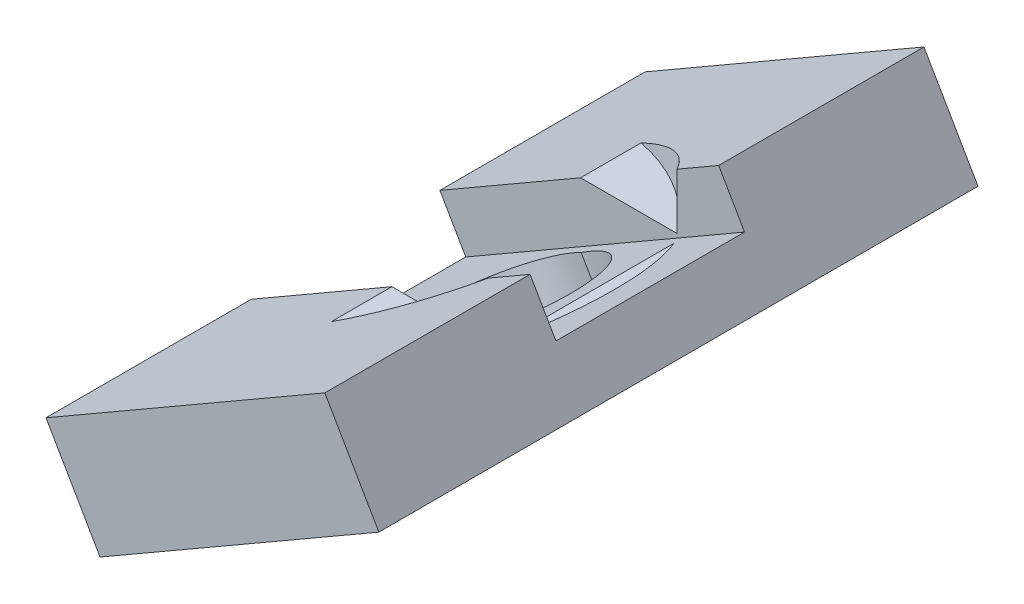
ISO-10303-21;
HEADER;
FILE_DESCRIPTION(('STEP AP214'),'2;1');
FILE_NAME('part.step','',(''),(''),'','','');
FILE_SCHEMA(('AUTOMOTIVE_DESIGN { 1 0 10303 214 1 1 1 1 }'));
ENDSEC;
DATA;
#1=APPLICATION_CONTEXT('core data for automotive mechanical design processes');
#2=APPLICATION_PROTOCOL_DEFINITION('international standard','automotive_design',2000,#1);
#3=PRODUCT_CONTEXT('',#1,'mechanical');
#4=PRODUCT('Part','Part','',(#3));
#5=PRODUCT_RELATED_PRODUCT_CATEGORY('part','',(#4));
#6=PRODUCT_DEFINITION_FORMATION('','',#4);
#7=PRODUCT_DEFINITION_CONTEXT('part definition',#1,'design');
#8=PRODUCT_DEFINITION('design','',#6,#7);
#9=PRODUCT_DEFINITION_SHAPE('','',#8);
#10=(LENGTH_UNIT() NAMED_UNIT(*) SI_UNIT(.MILLI.,.METRE.));
#11=(NAMED_UNIT(*) PLANE_ANGLE_UNIT() SI_UNIT($,.RADIAN.));
#12=(NAMED_UNIT(*) SI_UNIT($,.STERADIAN.) SOLID_ANGLE_UNIT());
#13=UNCERTAINTY_MEASURE_WITH_UNIT(LENGTH_MEASURE(1.E-05),#10,'distance_accuracy_value','');
#14=(GEOMETRIC_REPRESENTATION_CONTEXT(3) GLOBAL_UNCERTAINTY_ASSIGNED_CONTEXT((#13)) GLOBAL_UNIT_ASSIGNED_CONTEXT((#10,
#11,#12)) REPRESENTATION_CONTEXT('',''));
#15=CARTESIAN_POINT('',(0.,0.,0.));
#16=DIRECTION('',(0.,0.,1.));
#17=DIRECTION('',(1.,0.,0.));
#18=AXIS2_PLACEMENT_3D('',#15,#16,#17);
#19=CARTESIAN_POINT('',(0.,12.7,0.));
#20=DIRECTION('',(0.,-1.,0.));
#21=DIRECTION('',(0.,0.,-1.));
#22=AXIS2_PLACEMENT_3D('',#19,#20,#21);
#23=CYLINDRICAL_SURFACE('',#22,18.034);
#24=CARTESIAN_POINT('',(0.,-1.9646968374165,0.));
#25=DIRECTION('',(0.5,-0.866025403784439,0.));
#26=DIRECTION('',(-0.866025403784439,-0.5,0.));
#27=AXIS2_PLACEMENT_3D('',#24,#25,#26);
#28=ELLIPSE('',#27,20.8238695091314,18.034);
#29=CARTESIAN_POINT('',(3.40295474387526,0.,-17.7100269624622));
#30=VERTEX_POINT('',#29);
#31=CARTESIAN_POINT('',(14.446215109848,6.37582934502547,-10.795));
#32=VERTEX_POINT('',#31);
#33=EDGE_CURVE('E172',#30,#32,#28,.T.);
#34=ORIENTED_EDGE('',*,*,#33,.F.);
#35=CARTESIAN_POINT('',(0.,0.,0.));
#36=DIRECTION('',(0.,1.,0.));
#37=DIRECTION('',(0.,0.,1.));
#38=AXIS2_PLACEMENT_3D('',#35,#36,#37);
#39=CIRCLE('',#38,18.034);
#40=CARTESIAN_POINT('',(14.446215109848,0.,-10.795));
#41=VERTEX_POINT('',#40);
#42=EDGE_CURVE('E273',#41,#30,#39,.T.);
#43=ORIENTED_EDGE('',*,*,#42,.F.);
#44=DIRECTION('',(0.,-1.,0.));
#45=VECTOR('',#44,1.);
#46=CARTESIAN_POINT('',(14.446215109848,12.7,-10.795));
#47=LINE('',#46,#45);
#48=EDGE_CURVE('E221',#32,#41,#47,.T.);
#49=ORIENTED_EDGE('',*,*,#48,.F.);
#50=EDGE_LOOP('',(#34,#43,#49));
#51=FACE_BOUND('',#50,.T.);
#52=ADVANCED_FACE('F33',(#51),#23,.F.);
#53=CARTESIAN_POINT('',(-25.4,12.7,34.29));
#54=DIRECTION('',(0.,0.,-1.));
#55=DIRECTION('',(-1.,0.,0.));
#56=AXIS2_PLACEMENT_3D('',#53,#54,#55);
#57=PLANE('',#56);
#58=DIRECTION('',(0.866025403784439,0.5,0.));
#59=VECTOR('',#58,1.);
#60=CARTESIAN_POINT('',(-12.7,-23.5845452561248,34.29));
#61=LINE('',#60,#59);
#62=CARTESIAN_POINT('',(-6.51333102171488,-20.0126702561248,34.29));
#63=VERTEX_POINT('',#62);
#64=CARTESIAN_POINT('',(25.4,-1.58750000000005,34.29));
#65=VERTEX_POINT('',#64);
#66=EDGE_CURVE('E265',#63,#65,#61,.T.);
#67=ORIENTED_EDGE('',*,*,#66,.T.);
#68=DIRECTION('',(0.5,-0.866025403784439,0.));
#69=VECTOR('',#68,1.);
#70=CARTESIAN_POINT('',(25.4,-1.58750000000005,34.29));
#71=LINE('',#70,#69);
#72=CARTESIAN_POINT('',(19.2133310217149,9.12812499999998,34.29));
#73=VERTEX_POINT('',#72);
#74=EDGE_CURVE('E158',#73,#65,#71,.T.);
#75=ORIENTED_EDGE('',*,*,#74,.F.);
#76=DIRECTION('',(0.866025403784439,0.5,0.));
#77=VECTOR('',#76,1.);
#78=CARTESIAN_POINT('',(19.2133310217149,9.12812499999998,34.29));
#79=LINE('',#78,#77);
#80=CARTESIAN_POINT('',(-12.7,-9.29704525612474,34.29));
#81=VERTEX_POINT('',#80);
#82=EDGE_CURVE('E160',#81,#73,#79,.T.);
#83=ORIENTED_EDGE('',*,*,#82,.F.);
#84=DIRECTION('',(-0.5,0.866025403784438,0.));
#85=VECTOR('',#84,1.);
#86=CARTESIAN_POINT('',(-25.4,12.7,34.29));
#87=LINE('',#86,#85);
#88=EDGE_CURVE('E186',#63,#81,#87,.T.);
#89=ORIENTED_EDGE('',*,*,#88,.F.);
#90=EDGE_LOOP('',(#67,#75,#83,#89));
#91=FACE_BOUND('',#90,.T.);
#92=ADVANCED_FACE('F253',(#91),#57,.F.);
#93=CARTESIAN_POINT('',(-25.4,12.7,-34.29));
#94=DIRECTION('',(0.,0.,1.));
#95=DIRECTION('',(1.,0.,0.));
#96=AXIS2_PLACEMENT_3D('',#93,#94,#95);
#97=PLANE('',#96);
#98=DIRECTION('',(0.866025403784439,0.5,0.));
#99=VECTOR('',#98,1.);
#100=CARTESIAN_POINT('',(19.2133310217149,9.12812499999998,-34.29));
#101=LINE('',#100,#99);
#102=CARTESIAN_POINT('',(-12.7,-9.29704525612474,-34.29));
#103=VERTEX_POINT('',#102);
#104=CARTESIAN_POINT('',(19.2133310217149,9.12812499999998,-34.29));
#105=VERTEX_POINT('',#104);
#106=EDGE_CURVE('E48',#103,#105,#101,.T.);
#107=ORIENTED_EDGE('',*,*,#106,.T.);
#108=DIRECTION('',(0.5,-0.866025403784439,0.));
#109=VECTOR('',#108,1.);
#110=CARTESIAN_POINT('',(25.4,-1.58750000000005,-34.29));
#111=LINE('',#110,#109);
#112=CARTESIAN_POINT('',(25.4,-1.58750000000005,-34.29));
#113=VERTEX_POINT('',#112);
#114=EDGE_CURVE('E149',#105,#113,#111,.T.);
#115=ORIENTED_EDGE('',*,*,#114,.T.);
#116=DIRECTION('',(-0.866025403784439,-0.5,0.));
#117=VECTOR('',#116,1.);
#118=CARTESIAN_POINT('',(-12.7,-23.5845452561248,-34.29));
#119=LINE('',#118,#117);
#120=CARTESIAN_POINT('',(-6.51333102171488,-20.0126702561248,-34.29));
#121=VERTEX_POINT('',#120);
#122=EDGE_CURVE('E267',#113,#121,#119,.T.);
#123=ORIENTED_EDGE('',*,*,#122,.T.);
#124=DIRECTION('',(-0.5,0.866025403784438,0.));
#125=VECTOR('',#124,1.);
#126=CARTESIAN_POINT('',(-25.4,12.7,-34.29));
#127=LINE('',#126,#125);
#128=EDGE_CURVE('E55',#121,#103,#127,.T.);
#129=ORIENTED_EDGE('',*,*,#128,.T.);
#130=EDGE_LOOP('',(#107,#115,#123,#129));
#131=FACE_BOUND('',#130,.T.);
#132=ADVANCED_FACE('F35',(#131),#97,.F.);
#133=CARTESIAN_POINT('',(0.,0.,0.));
#134=DIRECTION('',(0.,-1.,0.));
#135=DIRECTION('',(0.,0.,-1.));
#136=AXIS2_PLACEMENT_3D('',#133,#134,#135);
#137=PLANE('',#136);
#138=ORIENTED_EDGE('',*,*,#42,.T.);
#139=DIRECTION('',(0.,0.,1.));
#140=VECTOR('',#139,1.);
#141=CARTESIAN_POINT('',(3.40295474387526,0.,0.));
#142=LINE('',#141,#140);
#143=CARTESIAN_POINT('',(3.40295474387523,0.,-10.795));
#144=VERTEX_POINT('',#143);
#145=EDGE_CURVE('E178',#30,#144,#142,.T.);
#146=ORIENTED_EDGE('',*,*,#145,.T.);
#147=DIRECTION('',(1.,0.,0.));
#148=VECTOR('',#147,1.);
#149=CARTESIAN_POINT('',(0.,0.,-10.795));
#150=LINE('',#149,#148);
#151=EDGE_CURVE('E219',#144,#41,#150,.T.);
#152=ORIENTED_EDGE('',*,*,#151,.T.);
#153=EDGE_LOOP('',(#138,#146,#152));
#154=FACE_BOUND('',#153,.T.);
#155=ADVANCED_FACE('F248',(#154),#137,.F.);
#156=DIRECTION('',(-1.,0.,0.));
#157=VECTOR('',#156,1.);
#158=CARTESIAN_POINT('',(0.,0.,10.795));
#159=LINE('',#158,#157);
#160=CARTESIAN_POINT('',(14.446215109848,0.,10.795));
#161=VERTEX_POINT('',#160);
#162=CARTESIAN_POINT('',(3.40295474387526,0.,10.795));
#163=VERTEX_POINT('',#162);
#164=EDGE_CURVE('E213',#161,#163,#159,.T.);
#165=ORIENTED_EDGE('',*,*,#164,.T.);
#166=DIRECTION('',(0.,0.,1.));
#167=VECTOR('',#166,1.);
#168=CARTESIAN_POINT('',(3.40295474387526,0.,0.));
#169=LINE('',#168,#167);
#170=CARTESIAN_POINT('',(3.40295474387526,0.,17.7100269624622));
#171=VERTEX_POINT('',#170);
#172=EDGE_CURVE('E171',#163,#171,#169,.T.);
#173=ORIENTED_EDGE('',*,*,#172,.T.);
#174=EDGE_CURVE('E271',#171,#161,#39,.T.);
#175=ORIENTED_EDGE('',*,*,#174,.T.);
#176=EDGE_LOOP('',(#165,#173,#175));
#177=FACE_BOUND('',#176,.T.);
#178=ADVANCED_FACE('F249',(#177),#137,.F.);
#179=CARTESIAN_POINT('',(14.446215109848,6.37582934502547,10.795));
#180=VERTEX_POINT('',#179);
#181=EDGE_CURVE('E168',#180,#171,#28,.T.);
#182=ORIENTED_EDGE('',*,*,#181,.F.);
#183=DIRECTION('',(0.,-1.,0.));
#184=VECTOR('',#183,1.);
#185=CARTESIAN_POINT('',(14.446215109848,12.7,10.795));
#186=LINE('',#185,#184);
#187=EDGE_CURVE('E216',#161,#180,#186,.F.);
#188=ORIENTED_EDGE('',*,*,#187,.F.);
#189=ORIENTED_EDGE('',*,*,#174,.F.);
#190=EDGE_LOOP('',(#182,#188,#189));
#191=FACE_BOUND('',#190,.T.);
#192=ADVANCED_FACE('F240',(#191),#23,.F.);
#193=CARTESIAN_POINT('',(-12.7,-23.5845452561248,-89.6480165829666));
#194=DIRECTION('',(0.5,-0.866025403784439,0.));
#195=DIRECTION('',(0.866025403784439,0.5,0.));
#196=AXIS2_PLACEMENT_3D('',#193,#194,#195);
#197=PLANE('',#196);
#198=DIRECTION('',(0.,0.,1.));
#199=VECTOR('',#198,1.);
#200=CARTESIAN_POINT('',(-6.51333102171488,-20.0126702561248,-34.29));
#201=LINE('',#200,#199);
#202=EDGE_CURVE('E188',#121,#63,#201,.T.);
#203=ORIENTED_EDGE('',*,*,#202,.F.);
#204=ORIENTED_EDGE('',*,*,#122,.F.);
#205=DIRECTION('',(0.,0.,-1.));
#206=VECTOR('',#205,1.);
#207=CARTESIAN_POINT('',(25.4,-1.5875,34.29));
#208=LINE('',#207,#206);
#209=EDGE_CURVE('E152',#65,#113,#208,.T.);
#210=ORIENTED_EDGE('',*,*,#209,.F.);
#211=ORIENTED_EDGE('',*,*,#66,.F.);
#212=EDGE_LOOP('',(#203,#204,#210,#211));
#213=FACE_BOUND('',#212,.T.);
#214=CARTESIAN_POINT('',(7.03740766425392,-12.1891476280624,0.));
#215=DIRECTION('',(0.5,-0.866025403784439,0.));
#216=DIRECTION('',(0.,0.,-1.));
#217=AXIS2_PLACEMENT_3D('',#214,#215,#216);
#218=ELLIPSE('',#217,9.525,8.24889197104678);
#219=CARTESIAN_POINT('',(8.06851916063477,-11.5938351280624,9.42525903158634));
#220=VERTEX_POINT('',#219);
#221=CARTESIAN_POINT('',(8.06851916063477,-11.5938351280624,-9.42525903158635));
#222=VERTEX_POINT('',#221);
#223=EDGE_CURVE('E224',#220,#222,#218,.T.);
#224=ORIENTED_EDGE('',*,*,#223,.F.);
#225=CARTESIAN_POINT('',(9.09963065701561,-10.9985226280624,0.));
#226=DIRECTION('',(0.5,-0.866025403784439,0.));
#227=DIRECTION('',(0.,0.,1.));
#228=AXIS2_PLACEMENT_3D('',#225,#226,#227);
#229=ELLIPSE('',#228,9.525,8.24889197104678);
#230=EDGE_CURVE('E315',#222,#220,#229,.T.);
#231=ORIENTED_EDGE('',*,*,#230,.F.);
#232=EDGE_LOOP('',(#224,#231));
#233=FACE_BOUND('',#232,.T.);
#234=ADVANCED_FACE('F235',(#213,#233),#197,.T.);
#235=CARTESIAN_POINT('',(-12.0219375431584,20.8226066301701,0.));
#236=DIRECTION('',(0.5,-0.866025403784439,0.));
#237=DIRECTION('',(0.,0.,-1.));
#238=AXIS2_PLACEMENT_3D('',#235,#236,#237);
#239=ELLIPSE('',#238,9.525,8.24889197104678);
#240=DIRECTION('',(0.5,-0.866025403784439,0.));
#241=VECTOR('',#240,1.);
#242=SURFACE_OF_LINEAR_EXTRUSION('',#239,#241);
#243=DIRECTION('',(0.5,-0.866025403784439,0.));
#244=VECTOR('',#243,1.);
#245=CARTESIAN_POINT('',(-10.9908260467775,21.4179191301701,-9.42525903158635));
#246=LINE('',#245,#244);
#247=CARTESIAN_POINT('',(4.84111149638086,-6.00380107683744,-9.42525903158635));
#248=VERTEX_POINT('',#247);
#249=EDGE_CURVE('E311',#248,#222,#246,.T.);
#250=ORIENTED_EDGE('',*,*,#249,.F.);
#251=CARTESIAN_POINT('',(3.81,-6.59911357683744,0.));
#252=DIRECTION('',(0.5,-0.866025403784439,0.));
#253=DIRECTION('',(0.,0.,-1.));
#254=AXIS2_PLACEMENT_3D('',#251,#252,#253);
#255=ELLIPSE('',#254,9.525,8.24889197104678);
#256=CARTESIAN_POINT('',(4.84111149638085,-6.00380107683744,9.42525903158634));
#257=VERTEX_POINT('',#256);
#258=EDGE_CURVE('E278',#248,#257,#255,.F.);
#259=ORIENTED_EDGE('',*,*,#258,.T.);
#260=DIRECTION('',(0.5,-0.866025403784439,0.));
#261=VECTOR('',#260,1.);
#262=CARTESIAN_POINT('',(-10.9908260467775,21.4179191301701,9.42525903158634));
#263=LINE('',#262,#261);
#264=EDGE_CURVE('E268',#257,#220,#263,.T.);
#265=ORIENTED_EDGE('',*,*,#264,.T.);
#266=ORIENTED_EDGE('',*,*,#223,.T.);
#267=EDGE_LOOP('',(#250,#259,#265,#266));
#268=FACE_BOUND('',#267,.T.);
#269=ADVANCED_FACE('F230',(#268),#242,.F.);
#270=CARTESIAN_POINT('',(-9.95971455039669,22.0132316301701,0.));
#271=DIRECTION('',(0.5,-0.866025403784439,0.));
#272=DIRECTION('',(0.,0.,1.));
#273=AXIS2_PLACEMENT_3D('',#270,#271,#272);
#274=ELLIPSE('',#273,9.525,8.24889197104678);
#275=DIRECTION('',(0.5,-0.866025403784439,0.));
#276=VECTOR('',#275,1.);
#277=SURFACE_OF_LINEAR_EXTRUSION('',#274,#276);
#278=ORIENTED_EDGE('',*,*,#264,.F.);
#279=CARTESIAN_POINT('',(5.8722229927617,-5.40848857683744,0.));
#280=DIRECTION('',(0.5,-0.866025403784439,0.));
#281=DIRECTION('',(0.,0.,1.));
#282=AXIS2_PLACEMENT_3D('',#279,#280,#281);
#283=ELLIPSE('',#282,9.525,8.24889197104678);
#284=EDGE_CURVE('E204',#257,#248,#283,.F.);
#285=ORIENTED_EDGE('',*,*,#284,.T.);
#286=ORIENTED_EDGE('',*,*,#249,.T.);
#287=ORIENTED_EDGE('',*,*,#230,.T.);
#288=EDGE_LOOP('',(#278,#285,#286,#287));
#289=FACE_BOUND('',#288,.T.);
#290=ADVANCED_FACE('F234',(#289),#277,.F.);
#291=CARTESIAN_POINT('',(20.9119375431585,20.8723308722691,-10.795));
#292=DIRECTION('',(0.,0.,-1.));
#293=DIRECTION('',(0.,1.,0.));
#294=AXIS2_PLACEMENT_3D('',#291,#292,#293);
#295=PLANE('',#294);
#296=DIRECTION('',(-0.866025403784439,-0.5,0.));
#297=VECTOR('',#296,1.);
#298=CARTESIAN_POINT('',(28.5319375431585,7.67410371859422,-10.795));
#299=LINE('',#298,#297);
#300=CARTESIAN_POINT('',(22.1725923357461,4.00253405122493,-10.795));
#301=VERTEX_POINT('',#300);
#302=CARTESIAN_POINT('',(-9.7407386859688,-14.4226362048998,-10.795));
#303=VERTEX_POINT('',#302);
#304=EDGE_CURVE('E201',#301,#303,#299,.T.);
#305=ORIENTED_EDGE('',*,*,#304,.F.);
#306=DIRECTION('',(-0.5,0.866025403784439,0.));
#307=VECTOR('',#306,1.);
#308=CARTESIAN_POINT('',(14.5525923357461,17.2007612048998,-10.795));
#309=LINE('',#308,#307);
#310=CARTESIAN_POINT('',(19.2133310217149,9.12812499999998,-10.795));
#311=VERTEX_POINT('',#310);
#312=EDGE_CURVE('E184',#301,#311,#309,.T.);
#313=ORIENTED_EDGE('',*,*,#312,.T.);
#314=DIRECTION('',(-0.866025403784439,-0.5,0.));
#315=VECTOR('',#314,1.);
#316=CARTESIAN_POINT('',(25.5726762291273,12.7996946673693,-10.795));
#317=LINE('',#316,#315);
#318=EDGE_CURVE('E142',#311,#32,#317,.T.);
#319=ORIENTED_EDGE('',*,*,#318,.T.);
#320=ORIENTED_EDGE('',*,*,#48,.T.);
#321=ORIENTED_EDGE('',*,*,#151,.F.);
#322=CARTESIAN_POINT('',(-12.7,-9.29704525612474,-10.795));
#323=VERTEX_POINT('',#322);
#324=EDGE_CURVE('E175',#144,#323,#317,.T.);
#325=ORIENTED_EDGE('',*,*,#324,.T.);
#326=DIRECTION('',(0.5,-0.866025403784438,0.));
#327=VECTOR('',#326,1.);
#328=CARTESIAN_POINT('',(-17.3607386859688,-1.22440905122497,-10.795));
#329=LINE('',#328,#327);
#330=EDGE_CURVE('E195',#323,#303,#329,.T.);
#331=ORIENTED_EDGE('',*,*,#330,.T.);
#332=EDGE_LOOP('',(#305,#313,#319,#320,#321,#325,#331));
#333=FACE_BOUND('',#332,.T.);
#334=ADVANCED_FACE('F293',(#333),#295,.F.);
#335=CARTESIAN_POINT('',(20.9119375431585,20.8723308722691,10.795));
#336=DIRECTION('',(0.,0.,1.));
#337=DIRECTION('',(0.,-1.,0.));
#338=AXIS2_PLACEMENT_3D('',#335,#336,#337);
#339=PLANE('',#338);
#340=DIRECTION('',(-0.5,0.866025403784438,0.));
#341=VECTOR('',#340,1.);
#342=CARTESIAN_POINT('',(-17.3607386859688,-1.22440905122497,10.795));
#343=LINE('',#342,#341);
#344=CARTESIAN_POINT('',(-9.7407386859688,-14.4226362048998,10.795));
#345=VERTEX_POINT('',#344);
#346=CARTESIAN_POINT('',(-12.7,-9.29704525612474,10.795));
#347=VERTEX_POINT('',#346);
#348=EDGE_CURVE('E192',#345,#347,#343,.T.);
#349=ORIENTED_EDGE('',*,*,#348,.T.);
#350=DIRECTION('',(0.866025403784439,0.5,0.));
#351=VECTOR('',#350,1.);
#352=CARTESIAN_POINT('',(25.5726762291273,12.7996946673693,10.795));
#353=LINE('',#352,#351);
#354=EDGE_CURVE('E169',#347,#163,#353,.T.);
#355=ORIENTED_EDGE('',*,*,#354,.T.);
#356=ORIENTED_EDGE('',*,*,#164,.F.);
#357=ORIENTED_EDGE('',*,*,#187,.T.);
#358=CARTESIAN_POINT('',(19.2133310217149,9.12812499999998,10.795));
#359=VERTEX_POINT('',#358);
#360=EDGE_CURVE('E145',#180,#359,#353,.T.);
#361=ORIENTED_EDGE('',*,*,#360,.T.);
#362=DIRECTION('',(0.5,-0.866025403784439,0.));
#363=VECTOR('',#362,1.);
#364=CARTESIAN_POINT('',(14.5525923357461,17.2007612048998,10.795));
#365=LINE('',#364,#363);
#366=CARTESIAN_POINT('',(22.1725923357461,4.00253405122493,10.795));
#367=VERTEX_POINT('',#366);
#368=EDGE_CURVE('E181',#359,#367,#365,.T.);
#369=ORIENTED_EDGE('',*,*,#368,.T.);
#370=DIRECTION('',(-0.866025403784439,-0.5,0.));
#371=VECTOR('',#370,1.);
#372=CARTESIAN_POINT('',(28.5319375431585,7.67410371859422,10.795));
#373=LINE('',#372,#371);
#374=EDGE_CURVE('E202',#367,#345,#373,.T.);
#375=ORIENTED_EDGE('',*,*,#374,.T.);
#376=EDGE_LOOP('',(#349,#355,#356,#357,#361,#369,#375));
#377=FACE_BOUND('',#376,.T.);
#378=ADVANCED_FACE('F286',(#377),#339,.F.);
#379=CARTESIAN_POINT('',(28.5319375431585,7.67410371859422,-10.795));
#380=DIRECTION('',(0.5,-0.866025403784439,0.));
#381=DIRECTION('',(0.866025403784439,0.5,0.));
#382=AXIS2_PLACEMENT_3D('',#379,#380,#381);
#383=PLANE('',#382);
#384=CARTESIAN_POINT('',(0.,-8.7988181024499,0.));
#385=DIRECTION('',(0.5,-0.866025403784439,0.));
#386=DIRECTION('',(-0.866025403784439,-0.5,0.));
#387=AXIS2_PLACEMENT_3D('',#384,#385,#386);
#388=ELLIPSE('',#387,20.8238695091314,18.034);
#389=CARTESIAN_POINT('',(15.24,0.,-9.64196847121995));
#390=VERTEX_POINT('',#389);
#391=CARTESIAN_POINT('',(15.24,0.,9.64196847121995));
#392=VERTEX_POINT('',#391);
#393=EDGE_CURVE('E211',#390,#392,#388,.T.);
#394=ORIENTED_EDGE('',*,*,#393,.T.);
#395=DIRECTION('',(0.,0.,1.));
#396=VECTOR('',#395,1.);
#397=CARTESIAN_POINT('',(15.24,0.,0.));
#398=LINE('',#397,#396);
#399=EDGE_CURVE('E208',#390,#392,#398,.T.);
#400=ORIENTED_EDGE('',*,*,#399,.F.);
#401=EDGE_LOOP('',(#394,#400));
#402=FACE_BOUND('',#401,.T.);
#403=ORIENTED_EDGE('',*,*,#258,.F.);
#404=ORIENTED_EDGE('',*,*,#284,.F.);
#405=EDGE_LOOP('',(#403,#404));
#406=FACE_BOUND('',#405,.T.);
#407=ORIENTED_EDGE('',*,*,#374,.F.);
#408=DIRECTION('',(0.,0.,-1.));
#409=VECTOR('',#408,1.);
#410=CARTESIAN_POINT('',(22.1725923357461,4.00253405122493,-10.795));
#411=LINE('',#410,#409);
#412=EDGE_CURVE('E11',#367,#301,#411,.T.);
#413=ORIENTED_EDGE('',*,*,#412,.T.);
#414=ORIENTED_EDGE('',*,*,#304,.T.);
#415=DIRECTION('',(0.,0.,1.));
#416=VECTOR('',#415,1.);
#417=CARTESIAN_POINT('',(-9.7407386859688,-14.4226362048998,-10.795));
#418=LINE('',#417,#416);
#419=EDGE_CURVE('E198',#303,#345,#418,.T.);
#420=ORIENTED_EDGE('',*,*,#419,.T.);
#421=EDGE_LOOP('',(#407,#413,#414,#420));
#422=FACE_BOUND('',#421,.T.);
#423=ADVANCED_FACE('F251',(#402,#406,#422),#383,.F.);
#424=ORIENTED_EDGE('',*,*,#393,.F.);
#425=EDGE_CURVE('E275',#392,#390,#39,.T.);
#426=ORIENTED_EDGE('',*,*,#425,.F.);
#427=EDGE_LOOP('',(#424,#426));
#428=FACE_BOUND('',#427,.T.);
#429=ADVANCED_FACE('F246',(#428),#23,.F.);
#430=ORIENTED_EDGE('',*,*,#425,.T.);
#431=ORIENTED_EDGE('',*,*,#399,.T.);
#432=EDGE_LOOP('',(#430,#431));
#433=FACE_BOUND('',#432,.T.);
#434=ADVANCED_FACE('F242',(#433),#137,.F.);
#435=CARTESIAN_POINT('',(-25.4,12.7,-34.29));
#436=DIRECTION('',(0.866025403784438,0.5,0.));
#437=DIRECTION('',(-0.5,0.866025403784438,0.));
#438=AXIS2_PLACEMENT_3D('',#435,#436,#437);
#439=PLANE('',#438);
#440=ORIENTED_EDGE('',*,*,#88,.T.);
#441=DIRECTION('',(0.,0.,-1.));
#442=VECTOR('',#441,1.);
#443=CARTESIAN_POINT('',(-12.7,-9.29704525612474,-34.29));
#444=LINE('',#443,#442);
#445=EDGE_CURVE('E41',#81,#347,#444,.T.);
#446=ORIENTED_EDGE('',*,*,#445,.T.);
#447=ORIENTED_EDGE('',*,*,#348,.F.);
#448=ORIENTED_EDGE('',*,*,#419,.F.);
#449=ORIENTED_EDGE('',*,*,#330,.F.);
#450=DIRECTION('',(0.,0.,1.));
#451=VECTOR('',#450,1.);
#452=CARTESIAN_POINT('',(-12.7,-9.29704525612474,-34.29));
#453=LINE('',#452,#451);
#454=EDGE_CURVE('E156',#103,#323,#453,.T.);
#455=ORIENTED_EDGE('',*,*,#454,.F.);
#456=ORIENTED_EDGE('',*,*,#128,.F.);
#457=ORIENTED_EDGE('',*,*,#202,.T.);
#458=EDGE_LOOP('',(#440,#446,#447,#448,#449,#455,#456,#457));
#459=FACE_BOUND('',#458,.T.);
#460=ADVANCED_FACE('F245',(#459),#439,.F.);
#461=CARTESIAN_POINT('',(25.4,-1.58750000000005,-34.29));
#462=DIRECTION('',(-0.866025403784439,-0.5,0.));
#463=DIRECTION('',(0.5,-0.866025403784439,0.));
#464=AXIS2_PLACEMENT_3D('',#461,#462,#463);
#465=PLANE('',#464);
#466=ORIENTED_EDGE('',*,*,#412,.F.);
#467=ORIENTED_EDGE('',*,*,#368,.F.);
#468=DIRECTION('',(0.,0.,1.));
#469=VECTOR('',#468,1.);
#470=CARTESIAN_POINT('',(19.2133310217149,9.12812499999998,-34.29));
#471=LINE('',#470,#469);
#472=EDGE_CURVE('E146',#359,#73,#471,.T.);
#473=ORIENTED_EDGE('',*,*,#472,.T.);
#474=ORIENTED_EDGE('',*,*,#74,.T.);
#475=ORIENTED_EDGE('',*,*,#209,.T.);
#476=ORIENTED_EDGE('',*,*,#114,.F.);
#477=EDGE_CURVE('E138',#105,#311,#471,.T.);
#478=ORIENTED_EDGE('',*,*,#477,.T.);
#479=ORIENTED_EDGE('',*,*,#312,.F.);
#480=EDGE_LOOP('',(#466,#467,#473,#474,#475,#476,#478,#479));
#481=FACE_BOUND('',#480,.T.);
#482=ADVANCED_FACE('F150',(#481),#465,.F.);
#483=CARTESIAN_POINT('',(19.2133310217149,9.12812499999998,-34.29));
#484=DIRECTION('',(0.5,-0.866025403784439,0.));
#485=DIRECTION('',(0.866025403784439,0.5,0.));
#486=AXIS2_PLACEMENT_3D('',#483,#484,#485);
#487=PLANE('',#486);
#488=ORIENTED_EDGE('',*,*,#477,.F.);
#489=ORIENTED_EDGE('',*,*,#106,.F.);
#490=ORIENTED_EDGE('',*,*,#454,.T.);
#491=ORIENTED_EDGE('',*,*,#324,.F.);
#492=ORIENTED_EDGE('',*,*,#145,.F.);
#493=ORIENTED_EDGE('',*,*,#33,.T.);
#494=ORIENTED_EDGE('',*,*,#318,.F.);
#495=EDGE_LOOP('',(#488,#489,#490,#491,#492,#493,#494));
#496=FACE_BOUND('',#495,.T.);
#497=ADVANCED_FACE('F140',(#496),#487,.F.);
#498=ORIENTED_EDGE('',*,*,#445,.F.);
#499=ORIENTED_EDGE('',*,*,#82,.T.);
#500=ORIENTED_EDGE('',*,*,#472,.F.);
#501=ORIENTED_EDGE('',*,*,#360,.F.);
#502=ORIENTED_EDGE('',*,*,#181,.T.);
#503=ORIENTED_EDGE('',*,*,#172,.F.);
#504=ORIENTED_EDGE('',*,*,#354,.F.);
#505=EDGE_LOOP('',(#498,#499,#500,#501,#502,#503,#504));
#506=FACE_BOUND('',#505,.T.);
#507=ADVANCED_FACE('F332',(#506),#487,.F.);
#508=CLOSED_SHELL('',(#52,#92,#132,#155,#178,#192,#234,#269,#290,#334,#378,#423,#429,#434,#460,
#482,#497,#507));
#509=MANIFOLD_SOLID_BREP('B2',#508);
#510=ADVANCED_BREP_SHAPE_REPRESENTATION('',(#18,#509),#14);
#511=SHAPE_DEFINITION_REPRESENTATION(#9,#510);
ENDSEC;
END-ISO-10303-21;
